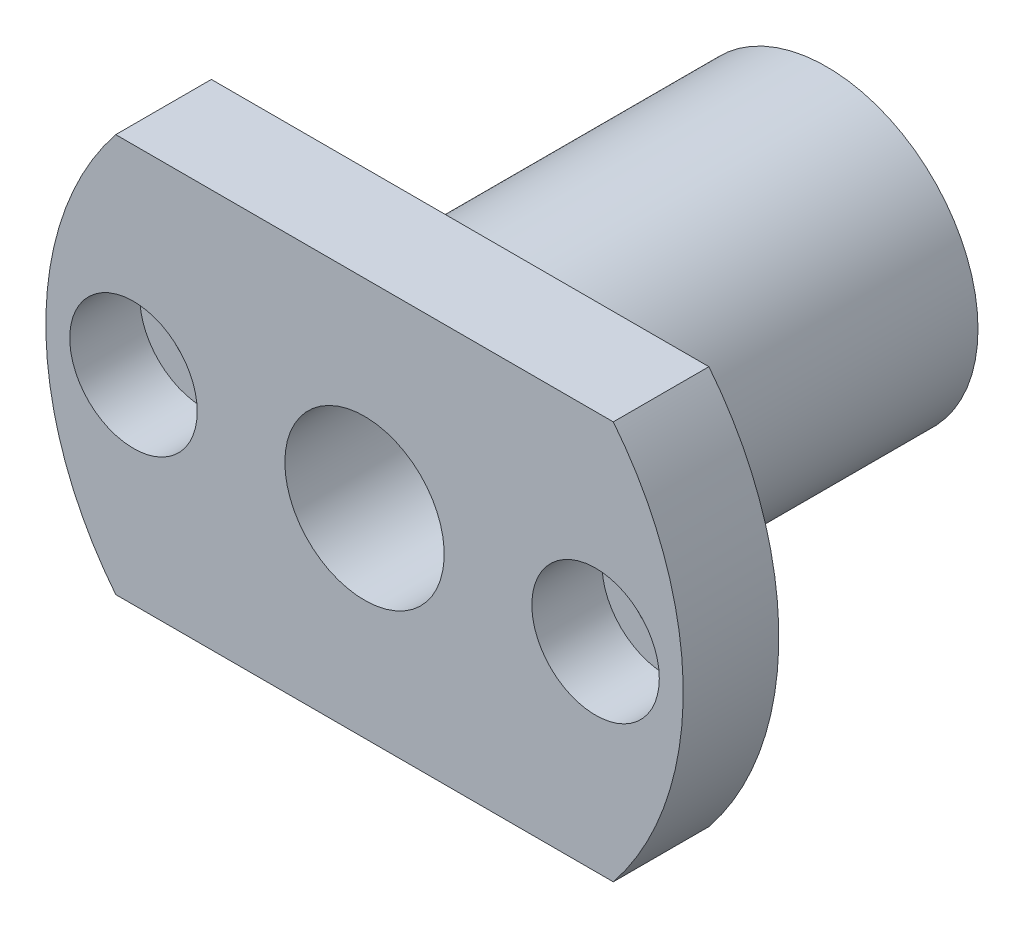
ISO-10303-21;
HEADER;
FILE_DESCRIPTION(('STEP AP214'),'2;1');
FILE_NAME('part.step','',(''),(''),'','','');
FILE_SCHEMA(('AUTOMOTIVE_DESIGN { 1 0 10303 214 1 1 1 1 }'));
ENDSEC;
DATA;
#1=APPLICATION_CONTEXT('core data for automotive mechanical design processes');
#2=APPLICATION_PROTOCOL_DEFINITION('international standard','automotive_design',2000,#1);
#3=PRODUCT_CONTEXT('',#1,'mechanical');
#4=PRODUCT('Part','Part','',(#3));
#5=PRODUCT_RELATED_PRODUCT_CATEGORY('part','',(#4));
#6=PRODUCT_DEFINITION_FORMATION('','',#4);
#7=PRODUCT_DEFINITION_CONTEXT('part definition',#1,'design');
#8=PRODUCT_DEFINITION('design','',#6,#7);
#9=PRODUCT_DEFINITION_SHAPE('','',#8);
#10=(LENGTH_UNIT() NAMED_UNIT(*) SI_UNIT(.MILLI.,.METRE.));
#11=(NAMED_UNIT(*) PLANE_ANGLE_UNIT() SI_UNIT($,.RADIAN.));
#12=(NAMED_UNIT(*) SI_UNIT($,.STERADIAN.) SOLID_ANGLE_UNIT());
#13=UNCERTAINTY_MEASURE_WITH_UNIT(LENGTH_MEASURE(1.E-05),#10,'distance_accuracy_value','');
#14=(GEOMETRIC_REPRESENTATION_CONTEXT(3) GLOBAL_UNCERTAINTY_ASSIGNED_CONTEXT((#13)) GLOBAL_UNIT_ASSIGNED_CONTEXT((#10,
#11,#12)) REPRESENTATION_CONTEXT('',''));
#15=CARTESIAN_POINT('',(0.,0.,0.));
#16=DIRECTION('',(0.,0.,1.));
#17=DIRECTION('',(1.,0.,0.));
#18=AXIS2_PLACEMENT_3D('',#15,#16,#17);
#19=CARTESIAN_POINT('',(-5.,0.,29.));
#20=DIRECTION('',(0.,0.,-1.));
#21=DIRECTION('',(-1.,0.,0.));
#22=AXIS2_PLACEMENT_3D('',#19,#20,#21);
#23=PLANE('',#22);
#24=CARTESIAN_POINT('',(14.5,0.,29.));
#25=DIRECTION('',(0.,0.,1.));
#26=DIRECTION('',(1.,0.,0.));
#27=AXIS2_PLACEMENT_3D('',#24,#25,#26);
#28=CIRCLE('',#27,4.00000000000001);
#29=CARTESIAN_POINT('',(18.5,0.,29.));
#30=VERTEX_POINT('',#29);
#31=EDGE_CURVE('E127',#30,#30,#28,.T.);
#32=ORIENTED_EDGE('',*,*,#31,.F.);
#33=EDGE_LOOP('',(#32));
#34=FACE_BOUND('',#33,.T.);
#35=CARTESIAN_POINT('',(0.,0.,29.));
#36=DIRECTION('',(0.,0.,-1.));
#37=DIRECTION('',(-1.,0.,0.));
#38=AXIS2_PLACEMENT_3D('',#35,#36,#37);
#39=CIRCLE('',#38,5.);
#40=CARTESIAN_POINT('',(-5.,0.,29.));
#41=VERTEX_POINT('',#40);
#42=EDGE_CURVE('E108',#41,#41,#39,.T.);
#43=ORIENTED_EDGE('',*,*,#42,.T.);
#44=EDGE_LOOP('',(#43));
#45=FACE_BOUND('',#44,.T.);
#46=DIRECTION('',(-1.,0.,0.));
#47=VECTOR('',#46,1.);
#48=CARTESIAN_POINT('',(-5.,-12.5,29.));
#49=LINE('',#48,#47);
#50=CARTESIAN_POINT('',(15.612494995996,-12.5,29.));
#51=VERTEX_POINT('',#50);
#52=CARTESIAN_POINT('',(-15.612494995996,-12.5,29.));
#53=VERTEX_POINT('',#52);
#54=EDGE_CURVE('E12',#51,#53,#49,.T.);
#55=ORIENTED_EDGE('',*,*,#54,.F.);
#56=CARTESIAN_POINT('',(0.,0.,29.));
#57=DIRECTION('',(0.,0.,-1.));
#58=DIRECTION('',(-1.,0.,0.));
#59=AXIS2_PLACEMENT_3D('',#56,#57,#58);
#60=CIRCLE('',#59,20.);
#61=CARTESIAN_POINT('',(15.612494995996,12.5,29.));
#62=VERTEX_POINT('',#61);
#63=EDGE_CURVE('E51',#62,#51,#60,.T.);
#64=ORIENTED_EDGE('',*,*,#63,.F.);
#65=DIRECTION('',(1.,0.,0.));
#66=VECTOR('',#65,1.);
#67=CARTESIAN_POINT('',(-5.,12.5,29.));
#68=LINE('',#67,#66);
#69=CARTESIAN_POINT('',(-15.612494995996,12.5,29.));
#70=VERTEX_POINT('',#69);
#71=EDGE_CURVE('E44',#70,#62,#68,.T.);
#72=ORIENTED_EDGE('',*,*,#71,.F.);
#73=EDGE_CURVE('E91',#53,#70,#60,.T.);
#74=ORIENTED_EDGE('',*,*,#73,.F.);
#75=EDGE_LOOP('',(#55,#64,#72,#74));
#76=FACE_BOUND('',#75,.T.);
#77=CARTESIAN_POINT('',(-14.5,0.,29.));
#78=DIRECTION('',(0.,0.,1.));
#79=DIRECTION('',(1.,0.,0.));
#80=AXIS2_PLACEMENT_3D('',#77,#78,#79);
#81=CIRCLE('',#80,4.00000000000001);
#82=CARTESIAN_POINT('',(-10.5,0.,29.));
#83=VERTEX_POINT('',#82);
#84=EDGE_CURVE('E139',#83,#83,#81,.T.);
#85=ORIENTED_EDGE('',*,*,#84,.F.);
#86=EDGE_LOOP('',(#85));
#87=FACE_BOUND('',#86,.T.);
#88=ADVANCED_FACE('F36',(#34,#45,#76,#87),#23,.F.);
#89=CARTESIAN_POINT('',(0.,0.,0.));
#90=DIRECTION('',(0.,0.,-1.));
#91=DIRECTION('',(-1.,0.,0.));
#92=AXIS2_PLACEMENT_3D('',#89,#90,#91);
#93=CYLINDRICAL_SURFACE('',#92,20.);
#94=ORIENTED_EDGE('',*,*,#63,.T.);
#95=DIRECTION('',(0.,0.,-1.));
#96=VECTOR('',#95,1.);
#97=CARTESIAN_POINT('',(15.612494995996,-12.5,0.));
#98=LINE('',#97,#96);
#99=CARTESIAN_POINT('',(15.612494995996,-12.5,23.));
#100=VERTEX_POINT('',#99);
#101=EDGE_CURVE('E114',#100,#51,#98,.F.);
#102=ORIENTED_EDGE('',*,*,#101,.F.);
#103=CARTESIAN_POINT('',(0.,0.,23.));
#104=DIRECTION('',(0.,0.,-1.));
#105=DIRECTION('',(-1.,0.,0.));
#106=AXIS2_PLACEMENT_3D('',#103,#104,#105);
#107=CIRCLE('',#106,20.);
#108=CARTESIAN_POINT('',(15.612494995996,12.5,23.));
#109=VERTEX_POINT('',#108);
#110=EDGE_CURVE('E96',#109,#100,#107,.T.);
#111=ORIENTED_EDGE('',*,*,#110,.F.);
#112=DIRECTION('',(0.,0.,-1.));
#113=VECTOR('',#112,1.);
#114=CARTESIAN_POINT('',(15.612494995996,12.5,0.));
#115=LINE('',#114,#113);
#116=EDGE_CURVE('E79',#62,#109,#115,.T.);
#117=ORIENTED_EDGE('',*,*,#116,.F.);
#118=EDGE_LOOP('',(#94,#102,#111,#117));
#119=FACE_BOUND('',#118,.T.);
#120=ADVANCED_FACE('F38',(#119),#93,.T.);
#121=DIRECTION('',(0.,0.,-1.));
#122=VECTOR('',#121,1.);
#123=CARTESIAN_POINT('',(-15.612494995996,12.5,0.));
#124=LINE('',#123,#122);
#125=CARTESIAN_POINT('',(-15.612494995996,12.5,23.));
#126=VERTEX_POINT('',#125);
#127=EDGE_CURVE('E59',#126,#70,#124,.F.);
#128=ORIENTED_EDGE('',*,*,#127,.F.);
#129=CARTESIAN_POINT('',(-15.612494995996,-12.5,23.));
#130=VERTEX_POINT('',#129);
#131=EDGE_CURVE('E89',#130,#126,#107,.T.);
#132=ORIENTED_EDGE('',*,*,#131,.F.);
#133=DIRECTION('',(0.,0.,-1.));
#134=VECTOR('',#133,1.);
#135=CARTESIAN_POINT('',(-15.612494995996,-12.5,0.));
#136=LINE('',#135,#134);
#137=EDGE_CURVE('E112',#53,#130,#136,.T.);
#138=ORIENTED_EDGE('',*,*,#137,.F.);
#139=ORIENTED_EDGE('',*,*,#73,.T.);
#140=EDGE_LOOP('',(#128,#132,#138,#139));
#141=FACE_BOUND('',#140,.T.);
#142=ADVANCED_FACE('F87',(#141),#93,.T.);
#143=CARTESIAN_POINT('',(-9.5,0.,23.));
#144=DIRECTION('',(0.,0.,1.));
#145=DIRECTION('',(1.,0.,0.));
#146=AXIS2_PLACEMENT_3D('',#143,#144,#145);
#147=PLANE('',#146);
#148=CARTESIAN_POINT('',(-14.5,0.,23.));
#149=DIRECTION('',(0.,0.,1.));
#150=DIRECTION('',(1.,0.,0.));
#151=AXIS2_PLACEMENT_3D('',#148,#149,#150);
#152=CIRCLE('',#151,2.25000000000001);
#153=CARTESIAN_POINT('',(-12.25,0.,23.));
#154=VERTEX_POINT('',#153);
#155=EDGE_CURVE('E130',#154,#154,#152,.T.);
#156=ORIENTED_EDGE('',*,*,#155,.T.);
#157=EDGE_LOOP('',(#156));
#158=FACE_BOUND('',#157,.T.);
#159=CARTESIAN_POINT('',(14.5,0.,23.));
#160=DIRECTION('',(0.,0.,1.));
#161=DIRECTION('',(1.,0.,0.));
#162=AXIS2_PLACEMENT_3D('',#159,#160,#161);
#163=CIRCLE('',#162,2.25000000000001);
#164=CARTESIAN_POINT('',(16.75,0.,23.));
#165=VERTEX_POINT('',#164);
#166=EDGE_CURVE('E117',#165,#165,#163,.T.);
#167=ORIENTED_EDGE('',*,*,#166,.T.);
#168=EDGE_LOOP('',(#167));
#169=FACE_BOUND('',#168,.T.);
#170=CARTESIAN_POINT('',(0.,0.,23.));
#171=DIRECTION('',(0.,0.,-1.));
#172=DIRECTION('',(-1.,0.,0.));
#173=AXIS2_PLACEMENT_3D('',#170,#171,#172);
#174=CIRCLE('',#173,9.5);
#175=CARTESIAN_POINT('',(-9.5,0.,23.));
#176=VERTEX_POINT('',#175);
#177=EDGE_CURVE('E98',#176,#176,#174,.T.);
#178=ORIENTED_EDGE('',*,*,#177,.F.);
#179=EDGE_LOOP('',(#178));
#180=FACE_BOUND('',#179,.T.);
#181=DIRECTION('',(-1.,0.,0.));
#182=VECTOR('',#181,1.);
#183=CARTESIAN_POINT('',(20.,-12.5,23.));
#184=LINE('',#183,#182);
#185=EDGE_CURVE('E83',#100,#130,#184,.T.);
#186=ORIENTED_EDGE('',*,*,#185,.T.);
#187=ORIENTED_EDGE('',*,*,#131,.T.);
#188=DIRECTION('',(1.,0.,0.));
#189=VECTOR('',#188,1.);
#190=CARTESIAN_POINT('',(20.,12.5,23.));
#191=LINE('',#190,#189);
#192=EDGE_CURVE('E77',#126,#109,#191,.T.);
#193=ORIENTED_EDGE('',*,*,#192,.T.);
#194=ORIENTED_EDGE('',*,*,#110,.T.);
#195=EDGE_LOOP('',(#186,#187,#193,#194));
#196=FACE_BOUND('',#195,.T.);
#197=ADVANCED_FACE('F94',(#158,#169,#180,#196),#147,.F.);
#198=CARTESIAN_POINT('',(0.,0.,0.));
#199=DIRECTION('',(0.,0.,-1.));
#200=DIRECTION('',(-1.,0.,0.));
#201=AXIS2_PLACEMENT_3D('',#198,#199,#200);
#202=CYLINDRICAL_SURFACE('',#201,9.5);
#203=CARTESIAN_POINT('',(0.,0.,0.));
#204=DIRECTION('',(0.,0.,-1.));
#205=DIRECTION('',(-1.,0.,0.));
#206=AXIS2_PLACEMENT_3D('',#203,#204,#205);
#207=CIRCLE('',#206,9.49999999999999);
#208=CARTESIAN_POINT('',(-9.49999999999999,0.,0.));
#209=VERTEX_POINT('',#208);
#210=EDGE_CURVE('E102',#209,#209,#207,.T.);
#211=ORIENTED_EDGE('',*,*,#210,.F.);
#212=EDGE_LOOP('',(#211));
#213=FACE_BOUND('',#212,.T.);
#214=ORIENTED_EDGE('',*,*,#177,.T.);
#215=EDGE_LOOP('',(#214));
#216=FACE_BOUND('',#215,.T.);
#217=ADVANCED_FACE('F164',(#213,#216),#202,.T.);
#218=CARTESIAN_POINT('',(-9.49999999999999,0.,0.));
#219=DIRECTION('',(0.,0.,1.));
#220=DIRECTION('',(1.,0.,0.));
#221=AXIS2_PLACEMENT_3D('',#218,#219,#220);
#222=PLANE('',#221);
#223=CARTESIAN_POINT('',(0.,0.,0.));
#224=DIRECTION('',(0.,0.,-1.));
#225=DIRECTION('',(-1.,0.,0.));
#226=AXIS2_PLACEMENT_3D('',#223,#224,#225);
#227=CIRCLE('',#226,5.);
#228=CARTESIAN_POINT('',(-5.,0.,0.));
#229=VERTEX_POINT('',#228);
#230=EDGE_CURVE('E105',#229,#229,#227,.T.);
#231=ORIENTED_EDGE('',*,*,#230,.F.);
#232=EDGE_LOOP('',(#231));
#233=FACE_BOUND('',#232,.T.);
#234=ORIENTED_EDGE('',*,*,#210,.T.);
#235=EDGE_LOOP('',(#234));
#236=FACE_BOUND('',#235,.T.);
#237=ADVANCED_FACE('F160',(#233,#236),#222,.F.);
#238=CARTESIAN_POINT('',(0.,0.,0.));
#239=DIRECTION('',(0.,0.,-1.));
#240=DIRECTION('',(-1.,0.,0.));
#241=AXIS2_PLACEMENT_3D('',#238,#239,#240);
#242=CYLINDRICAL_SURFACE('',#241,5.);
#243=ORIENTED_EDGE('',*,*,#42,.F.);
#244=EDGE_LOOP('',(#243));
#245=FACE_BOUND('',#244,.T.);
#246=ORIENTED_EDGE('',*,*,#230,.T.);
#247=EDGE_LOOP('',(#246));
#248=FACE_BOUND('',#247,.T.);
#249=ADVANCED_FACE('F157',(#245,#248),#242,.F.);
#250=CARTESIAN_POINT('',(20.,12.5,-34.134227919873));
#251=DIRECTION('',(0.,1.,0.));
#252=DIRECTION('',(0.,0.,1.));
#253=AXIS2_PLACEMENT_3D('',#250,#251,#252);
#254=PLANE('',#253);
#255=ORIENTED_EDGE('',*,*,#116,.T.);
#256=ORIENTED_EDGE('',*,*,#192,.F.);
#257=ORIENTED_EDGE('',*,*,#127,.T.);
#258=ORIENTED_EDGE('',*,*,#71,.T.);
#259=EDGE_LOOP('',(#255,#256,#257,#258));
#260=FACE_BOUND('',#259,.T.);
#261=ADVANCED_FACE('F78',(#260),#254,.T.);
#262=CARTESIAN_POINT('',(20.,-12.5,-34.134227919873));
#263=DIRECTION('',(0.,-1.,0.));
#264=DIRECTION('',(0.,0.,-1.));
#265=AXIS2_PLACEMENT_3D('',#262,#263,#264);
#266=PLANE('',#265);
#267=ORIENTED_EDGE('',*,*,#137,.T.);
#268=ORIENTED_EDGE('',*,*,#185,.F.);
#269=ORIENTED_EDGE('',*,*,#101,.T.);
#270=ORIENTED_EDGE('',*,*,#54,.T.);
#271=EDGE_LOOP('',(#267,#268,#269,#270));
#272=FACE_BOUND('',#271,.T.);
#273=ADVANCED_FACE('F155',(#272),#266,.T.);
#274=CARTESIAN_POINT('',(14.5,0.,29.));
#275=DIRECTION('',(0.,0.,1.));
#276=DIRECTION('',(1.,0.,0.));
#277=AXIS2_PLACEMENT_3D('',#274,#275,#276);
#278=CYLINDRICAL_SURFACE('',#277,2.25000000000001);
#279=ORIENTED_EDGE('',*,*,#166,.F.);
#280=EDGE_LOOP('',(#279));
#281=FACE_BOUND('',#280,.T.);
#282=CARTESIAN_POINT('',(14.5,0.,24.6));
#283=DIRECTION('',(0.,0.,1.));
#284=DIRECTION('',(1.,0.,0.));
#285=AXIS2_PLACEMENT_3D('',#282,#283,#284);
#286=CIRCLE('',#285,2.25000000000001);
#287=CARTESIAN_POINT('',(16.75,0.,24.6));
#288=VERTEX_POINT('',#287);
#289=EDGE_CURVE('E121',#288,#288,#286,.T.);
#290=ORIENTED_EDGE('',*,*,#289,.T.);
#291=EDGE_LOOP('',(#290));
#292=FACE_BOUND('',#291,.T.);
#293=ADVANCED_FACE('F180',(#281,#292),#278,.F.);
#294=CARTESIAN_POINT('',(16.75,0.,24.6));
#295=DIRECTION('',(0.,0.,-1.));
#296=DIRECTION('',(-1.,0.,0.));
#297=AXIS2_PLACEMENT_3D('',#294,#295,#296);
#298=PLANE('',#297);
#299=ORIENTED_EDGE('',*,*,#289,.F.);
#300=EDGE_LOOP('',(#299));
#301=FACE_BOUND('',#300,.T.);
#302=CARTESIAN_POINT('',(14.5,0.,24.6));
#303=DIRECTION('',(0.,0.,1.));
#304=DIRECTION('',(1.,0.,0.));
#305=AXIS2_PLACEMENT_3D('',#302,#303,#304);
#306=CIRCLE('',#305,4.00000000000001);
#307=CARTESIAN_POINT('',(18.5,0.,24.6));
#308=VERTEX_POINT('',#307);
#309=EDGE_CURVE('E124',#308,#308,#306,.T.);
#310=ORIENTED_EDGE('',*,*,#309,.T.);
#311=EDGE_LOOP('',(#310));
#312=FACE_BOUND('',#311,.T.);
#313=ADVANCED_FACE('F183',(#301,#312),#298,.F.);
#314=CARTESIAN_POINT('',(14.5,0.,29.));
#315=DIRECTION('',(0.,0.,1.));
#316=DIRECTION('',(1.,0.,0.));
#317=AXIS2_PLACEMENT_3D('',#314,#315,#316);
#318=CYLINDRICAL_SURFACE('',#317,4.00000000000001);
#319=ORIENTED_EDGE('',*,*,#309,.F.);
#320=EDGE_LOOP('',(#319));
#321=FACE_BOUND('',#320,.T.);
#322=ORIENTED_EDGE('',*,*,#31,.T.);
#323=EDGE_LOOP('',(#322));
#324=FACE_BOUND('',#323,.T.);
#325=ADVANCED_FACE('F189',(#321,#324),#318,.F.);
#326=CARTESIAN_POINT('',(-14.5,0.,29.));
#327=DIRECTION('',(0.,0.,1.));
#328=DIRECTION('',(1.,0.,0.));
#329=AXIS2_PLACEMENT_3D('',#326,#327,#328);
#330=CYLINDRICAL_SURFACE('',#329,2.25000000000001);
#331=ORIENTED_EDGE('',*,*,#155,.F.);
#332=EDGE_LOOP('',(#331));
#333=FACE_BOUND('',#332,.T.);
#334=CARTESIAN_POINT('',(-14.5,0.,24.6));
#335=DIRECTION('',(0.,0.,1.));
#336=DIRECTION('',(1.,0.,0.));
#337=AXIS2_PLACEMENT_3D('',#334,#335,#336);
#338=CIRCLE('',#337,2.25000000000001);
#339=CARTESIAN_POINT('',(-12.25,0.,24.6));
#340=VERTEX_POINT('',#339);
#341=EDGE_CURVE('E133',#340,#340,#338,.T.);
#342=ORIENTED_EDGE('',*,*,#341,.T.);
#343=EDGE_LOOP('',(#342));
#344=FACE_BOUND('',#343,.T.);
#345=ADVANCED_FACE('F195',(#333,#344),#330,.F.);
#346=CARTESIAN_POINT('',(-12.25,0.,24.6));
#347=DIRECTION('',(0.,0.,-1.));
#348=DIRECTION('',(-1.,0.,0.));
#349=AXIS2_PLACEMENT_3D('',#346,#347,#348);
#350=PLANE('',#349);
#351=ORIENTED_EDGE('',*,*,#341,.F.);
#352=EDGE_LOOP('',(#351));
#353=FACE_BOUND('',#352,.T.);
#354=CARTESIAN_POINT('',(-14.5,0.,24.6));
#355=DIRECTION('',(0.,0.,1.));
#356=DIRECTION('',(1.,0.,0.));
#357=AXIS2_PLACEMENT_3D('',#354,#355,#356);
#358=CIRCLE('',#357,4.00000000000001);
#359=CARTESIAN_POINT('',(-10.5,0.,24.6));
#360=VERTEX_POINT('',#359);
#361=EDGE_CURVE('E136',#360,#360,#358,.T.);
#362=ORIENTED_EDGE('',*,*,#361,.T.);
#363=EDGE_LOOP('',(#362));
#364=FACE_BOUND('',#363,.T.);
#365=ADVANCED_FACE('F200',(#353,#364),#350,.F.);
#366=CARTESIAN_POINT('',(-14.5,0.,29.));
#367=DIRECTION('',(0.,0.,1.));
#368=DIRECTION('',(1.,0.,0.));
#369=AXIS2_PLACEMENT_3D('',#366,#367,#368);
#370=CYLINDRICAL_SURFACE('',#369,4.00000000000001);
#371=ORIENTED_EDGE('',*,*,#361,.F.);
#372=EDGE_LOOP('',(#371));
#373=FACE_BOUND('',#372,.T.);
#374=ORIENTED_EDGE('',*,*,#84,.T.);
#375=EDGE_LOOP('',(#374));
#376=FACE_BOUND('',#375,.T.);
#377=ADVANCED_FACE('F143',(#373,#376),#370,.F.);
#378=CLOSED_SHELL('',(#88,#120,#142,#197,#217,#237,#249,#261,#273,#293,#313,#325,#345,#365,#377));
#379=MANIFOLD_SOLID_BREP('B2',#378);
#380=ADVANCED_BREP_SHAPE_REPRESENTATION('',(#18,#379),#14);
#381=SHAPE_DEFINITION_REPRESENTATION(#9,#380);
ENDSEC;
END-ISO-10303-21;
